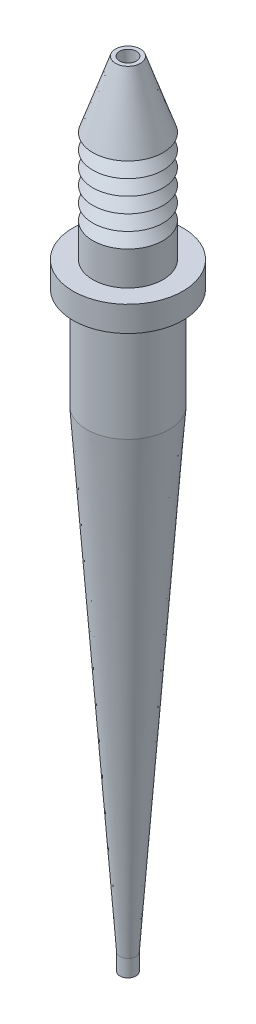
ISO-10303-21;
HEADER;
FILE_DESCRIPTION(('STEP AP214'),'2;1');
FILE_NAME('part.step','',(''),(''),'','','');
FILE_SCHEMA(('AUTOMOTIVE_DESIGN { 1 0 10303 214 1 1 1 1 }'));
ENDSEC;
DATA;
#1=APPLICATION_CONTEXT('core data for automotive mechanical design processes');
#2=APPLICATION_PROTOCOL_DEFINITION('international standard','automotive_design',2000,#1);
#3=PRODUCT_CONTEXT('',#1,'mechanical');
#4=PRODUCT('Part','Part','',(#3));
#5=PRODUCT_RELATED_PRODUCT_CATEGORY('part','',(#4));
#6=PRODUCT_DEFINITION_FORMATION('','',#4);
#7=PRODUCT_DEFINITION_CONTEXT('part definition',#1,'design');
#8=PRODUCT_DEFINITION('design','',#6,#7);
#9=PRODUCT_DEFINITION_SHAPE('','',#8);
#10=(LENGTH_UNIT() NAMED_UNIT(*) SI_UNIT(.MILLI.,.METRE.));
#11=(NAMED_UNIT(*) PLANE_ANGLE_UNIT() SI_UNIT($,.RADIAN.));
#12=(NAMED_UNIT(*) SI_UNIT($,.STERADIAN.) SOLID_ANGLE_UNIT());
#13=UNCERTAINTY_MEASURE_WITH_UNIT(LENGTH_MEASURE(1.E-05),#10,'distance_accuracy_value','');
#14=(GEOMETRIC_REPRESENTATION_CONTEXT(3) GLOBAL_UNCERTAINTY_ASSIGNED_CONTEXT((#13)) GLOBAL_UNIT_ASSIGNED_CONTEXT((#10,
#11,#12)) REPRESENTATION_CONTEXT('',''));
#15=CARTESIAN_POINT('',(0.,0.,0.));
#16=DIRECTION('',(0.,0.,1.));
#17=DIRECTION('',(1.,0.,0.));
#18=AXIS2_PLACEMENT_3D('',#15,#16,#17);
#19=CARTESIAN_POINT('',(0.950000000000014,-9.33673469387754,0.));
#20=DIRECTION('',(0.,1.,0.));
#21=DIRECTION('',(0.,0.,1.));
#22=AXIS2_PLACEMENT_3D('',#19,#20,#21);
#23=PLANE('',#22);
#24=CARTESIAN_POINT('',(0.,-9.33673469387754,0.));
#25=DIRECTION('',(0.,1.,0.));
#26=DIRECTION('',(0.,0.,1.));
#27=AXIS2_PLACEMENT_3D('',#24,#25,#26);
#28=CIRCLE('',#27,0.775000000000012);
#29=CARTESIAN_POINT('',(0.,-9.33673469387754,0.775000000000012));
#30=VERTEX_POINT('',#29);
#31=EDGE_CURVE('E48',#30,#30,#28,.T.);
#32=ORIENTED_EDGE('',*,*,#31,.T.);
#33=EDGE_LOOP('',(#32));
#34=FACE_BOUND('',#33,.T.);
#35=CARTESIAN_POINT('',(0.,-9.33673469387754,0.));
#36=DIRECTION('',(0.,1.,0.));
#37=DIRECTION('',(0.,0.,1.));
#38=AXIS2_PLACEMENT_3D('',#35,#36,#37);
#39=CIRCLE('',#38,0.950000000000014);
#40=CARTESIAN_POINT('',(0.,-9.33673469387754,0.950000000000014));
#41=VERTEX_POINT('',#40);
#42=EDGE_CURVE('E156',#41,#41,#39,.T.);
#43=ORIENTED_EDGE('',*,*,#42,.F.);
#44=EDGE_LOOP('',(#43));
#45=FACE_BOUND('',#44,.T.);
#46=ADVANCED_FACE('F39',(#34,#45),#23,.F.);
#47=CARTESIAN_POINT('',(0.,103.014460247081,0.));
#48=DIRECTION('',(0.,1.,0.));
#49=DIRECTION('',(0.,0.,1.));
#50=AXIS2_PLACEMENT_3D('',#47,#48,#49);
#51=CYLINDRICAL_SURFACE('',#50,0.575000000000014);
#52=CARTESIAN_POINT('',(0.,-9.13673469387755,0.));
#53=DIRECTION('',(0.,1.,0.));
#54=DIRECTION('',(0.,0.,1.));
#55=AXIS2_PLACEMENT_3D('',#52,#53,#54);
#56=CIRCLE('',#55,0.575000000000014);
#57=CARTESIAN_POINT('',(0.,-9.13673469387755,0.575000000000014));
#58=VERTEX_POINT('',#57);
#59=EDGE_CURVE('E10',#58,#58,#56,.F.);
#60=ORIENTED_EDGE('',*,*,#59,.T.);
#61=EDGE_LOOP('',(#60));
#62=FACE_BOUND('',#61,.T.);
#63=CARTESIAN_POINT('',(0.,-8.33673469387754,0.));
#64=DIRECTION('',(0.,1.,0.));
#65=DIRECTION('',(0.,0.,1.));
#66=AXIS2_PLACEMENT_3D('',#63,#64,#65);
#67=CIRCLE('',#66,0.575000000000014);
#68=CARTESIAN_POINT('',(0.,-8.33673469387754,0.575000000000014));
#69=VERTEX_POINT('',#68);
#70=EDGE_CURVE('E53',#69,#69,#67,.T.);
#71=ORIENTED_EDGE('',*,*,#70,.T.);
#72=EDGE_LOOP('',(#71));
#73=FACE_BOUND('',#72,.T.);
#74=ADVANCED_FACE('F164',(#62,#73),#51,.F.);
#75=CARTESIAN_POINT('',(0.575000000000014,-8.33673469387754,0.));
#76=DIRECTION('',(0.,1.,0.));
#77=DIRECTION('',(0.,0.,1.));
#78=AXIS2_PLACEMENT_3D('',#75,#76,#77);
#79=PLANE('',#78);
#80=ORIENTED_EDGE('',*,*,#70,.F.);
#81=EDGE_LOOP('',(#80));
#82=FACE_BOUND('',#81,.T.);
#83=CARTESIAN_POINT('',(0.,-8.33673469387754,0.));
#84=DIRECTION('',(0.,1.,0.));
#85=DIRECTION('',(0.,0.,1.));
#86=AXIS2_PLACEMENT_3D('',#83,#84,#85);
#87=CIRCLE('',#86,0.275000000000014);
#88=CARTESIAN_POINT('',(0.,-8.33673469387754,0.275000000000014));
#89=VERTEX_POINT('',#88);
#90=EDGE_CURVE('E58',#89,#89,#87,.T.);
#91=ORIENTED_EDGE('',*,*,#90,.T.);
#92=EDGE_LOOP('',(#91));
#93=FACE_BOUND('',#92,.T.);
#94=ADVANCED_FACE('F168',(#82,#93),#79,.F.);
#95=CARTESIAN_POINT('',(0.,103.014460247081,0.));
#96=DIRECTION('',(0.,1.,0.));
#97=DIRECTION('',(0.,0.,1.));
#98=AXIS2_PLACEMENT_3D('',#95,#96,#97);
#99=CYLINDRICAL_SURFACE('',#98,0.275000000000014);
#100=ORIENTED_EDGE('',*,*,#90,.F.);
#101=EDGE_LOOP('',(#100));
#102=FACE_BOUND('',#101,.T.);
#103=CARTESIAN_POINT('',(0.,-7.00267629513185,0.));
#104=DIRECTION('',(0.,1.,0.));
#105=DIRECTION('',(0.,0.,1.));
#106=AXIS2_PLACEMENT_3D('',#103,#104,#105);
#107=CIRCLE('',#106,0.275000000000014);
#108=CARTESIAN_POINT('',(0.,-7.00267629513184,0.275000000000014));
#109=VERTEX_POINT('',#108);
#110=EDGE_CURVE('E64',#109,#109,#107,.T.);
#111=ORIENTED_EDGE('',*,*,#110,.T.);
#112=EDGE_LOOP('',(#111));
#113=FACE_BOUND('',#112,.T.);
#114=ADVANCED_FACE('F173',(#102,#113),#99,.F.);
#115=CARTESIAN_POINT('',(0.,60.6632653061225,0.));
#116=DIRECTION('',(0.,1.,0.));
#117=DIRECTION('',(0.,0.,1.));
#118=AXIS2_PLACEMENT_3D('',#115,#116,#117);
#119=CONICAL_SURFACE('',#118,2.00000000000001,0.0254873636534141);
#120=CARTESIAN_POINT('',(0.,60.6632653061225,0.));
#121=DIRECTION('',(0.,1.,0.));
#122=DIRECTION('',(0.,0.,1.));
#123=AXIS2_PLACEMENT_3D('',#120,#121,#122);
#124=CIRCLE('',#123,2.00000000000001);
#125=CARTESIAN_POINT('',(0.,60.6632653061225,2.00000000000001));
#126=VERTEX_POINT('',#125);
#127=EDGE_CURVE('E68',#126,#126,#124,.T.);
#128=CARTESIAN_POINT('',(0.,-7.00267629513184,0.275000000000014));
#129=CARTESIAN_POINT('',(0.,-6.29782273678544,0.292968750000014));
#130=CARTESIAN_POINT('',(0.,-5.59296917843905,0.310937500000014));
#131=CARTESIAN_POINT('',(0.,-4.18326206174625,0.346875000000013));
#132=CARTESIAN_POINT('',(0.,-3.47840850339984,0.364843750000013));
#133=CARTESIAN_POINT('',(0.,-2.06870138670704,0.400781250000013));
#134=CARTESIAN_POINT('',(0.,-1.36384782836065,0.418750000000013));
#135=CARTESIAN_POINT('',(0.,0.0458592883321473,0.454687500000013));
#136=CARTESIAN_POINT('',(0.,0.750712846678545,0.472656250000013));
#137=CARTESIAN_POINT('',(0.,2.16041996337134,0.508593750000013));
#138=CARTESIAN_POINT('',(0.,2.86527352171774,0.526562500000012));
#139=CARTESIAN_POINT('',(0.,4.27498063841054,0.562500000000012));
#140=CARTESIAN_POINT('',(0.,4.97983419675694,0.580468750000012));
#141=CARTESIAN_POINT('',(0.,6.38954131344974,0.616406250000012));
#142=CARTESIAN_POINT('',(0.,7.09439487179614,0.634375000000012));
#143=CARTESIAN_POINT('',(0.,8.50410198848894,0.670312500000012));
#144=CARTESIAN_POINT('',(0.,9.20895554683533,0.688281250000012));
#145=CARTESIAN_POINT('',(0.,10.6186626635281,0.724218750000012));
#146=CARTESIAN_POINT('',(0.,11.3235162218745,0.742187500000012));
#147=CARTESIAN_POINT('',(0.,12.7332233385673,0.778125000000011));
#148=CARTESIAN_POINT('',(0.,13.4380768969137,0.796093750000011));
#149=CARTESIAN_POINT('',(0.,14.8477840136065,0.832031250000011));
#150=CARTESIAN_POINT('',(0.,15.5526375719529,0.850000000000011));
#151=CARTESIAN_POINT('',(0.,16.9623446886457,0.885937500000011));
#152=CARTESIAN_POINT('',(0.,17.6671982469921,0.903906250000011));
#153=CARTESIAN_POINT('',(0.,19.0769053636849,0.939843750000011));
#154=CARTESIAN_POINT('',(0.,19.7817589220313,0.95781250000001));
#155=CARTESIAN_POINT('',(0.,21.1914660387241,0.99375000000001));
#156=CARTESIAN_POINT('',(0.,21.8963195970705,1.01171875000001));
#157=CARTESIAN_POINT('',(0.,23.3060267137633,1.04765625000001));
#158=CARTESIAN_POINT('',(0.,24.0108802721097,1.06562500000001));
#159=CARTESIAN_POINT('',(0.,25.4205873888025,1.10156250000001));
#160=CARTESIAN_POINT('',(0.,26.1254409471489,1.11953125000001));
#161=CARTESIAN_POINT('',(0.,27.5351480638417,1.15546875000001));
#162=CARTESIAN_POINT('',(0.,28.2400016221881,1.17343750000001));
#163=CARTESIAN_POINT('',(0.,29.6497087388809,1.20937500000001));
#164=CARTESIAN_POINT('',(0.,30.3545622972273,1.22734375000001));
#165=CARTESIAN_POINT('',(0.,31.7642694139201,1.26328125000001));
#166=CARTESIAN_POINT('',(0.,32.4691229722665,1.28125000000001));
#167=CARTESIAN_POINT('',(0.,33.8788300889593,1.31718750000001));
#168=CARTESIAN_POINT('',(0.,34.5836836473057,1.33515625000001));
#169=CARTESIAN_POINT('',(0.,35.9933907639985,1.37109375000001));
#170=CARTESIAN_POINT('',(0.,36.6982443223449,1.38906250000001));
#171=CARTESIAN_POINT('',(0.,38.1079514390377,1.42500000000001));
#172=CARTESIAN_POINT('',(0.,38.8128049973841,1.44296875000001));
#173=CARTESIAN_POINT('',(0.,40.2225121140769,1.47890625000001));
#174=CARTESIAN_POINT('',(0.,40.9273656724233,1.49687500000001));
#175=CARTESIAN_POINT('',(0.,42.3370727891161,1.53281250000001));
#176=CARTESIAN_POINT('',(0.,43.0419263474625,1.55078125000001));
#177=CARTESIAN_POINT('',(0.,44.4516334641553,1.58671875000001));
#178=CARTESIAN_POINT('',(0.,45.1564870225017,1.60468750000001));
#179=CARTESIAN_POINT('',(0.,46.5661941391945,1.64062500000001));
#180=CARTESIAN_POINT('',(0.,47.2710476975409,1.65859375000001));
#181=CARTESIAN_POINT('',(0.,48.6807548142337,1.69453125000001));
#182=CARTESIAN_POINT('',(0.,49.3856083725801,1.71250000000001));
#183=CARTESIAN_POINT('',(0.,50.7953154892729,1.74843750000001));
#184=CARTESIAN_POINT('',(0.,51.5001690476193,1.76640625000001));
#185=CARTESIAN_POINT('',(0.,52.9098761643121,1.80234375000001));
#186=CARTESIAN_POINT('',(0.,53.6147297226585,1.82031250000001));
#187=CARTESIAN_POINT('',(0.,55.0244368393513,1.85625000000001));
#188=CARTESIAN_POINT('',(0.,55.7292903976977,1.87421875000001));
#189=CARTESIAN_POINT('',(0.,57.1389975143905,1.91015625000001));
#190=CARTESIAN_POINT('',(0.,57.8438510727369,1.92812500000001));
#191=CARTESIAN_POINT('',(0.,59.2535581894297,1.96406250000001));
#192=CARTESIAN_POINT('',(0.,59.9584117477761,1.98203125000001));
#193=CARTESIAN_POINT('',(0.,60.6632653061225,2.00000000000001));
#194=B_SPLINE_CURVE_WITH_KNOTS('',3,(#128,#129,#130,#131,#132,#133,#134,#135,#136,#137,#138,
#139,#140,#141,#142,#143,#144,#145,#146,#147,#148,#149,#150,#151,#152,#153,#154,#155,#156,#157,
#158,#159,#160,#161,#162,#163,#164,#165,#166,#167,#168,#169,#170,#171,#172,#173,#174,#175,#176,
#177,#178,#179,#180,#181,#182,#183,#184,#185,#186,#187,#188,#189,#190,#191,#192,#193),
.UNSPECIFIED.,.F.,.F.,(4,2,2,2,2,2,2,2,2,2,2,2,2,2,2,2,2,2,2,2,2,2,2,2,2,2,2,2,2,2,2,2,4),(0.,
2.11524767632806,4.23049535265614,6.3457430289842,8.46099070531226,10.5762383816403,
12.6914860579684,14.8067337342965,16.9219814106245,19.0372290869526,21.1524767632807,
23.2677244396087,25.3829721159368,27.4982197922649,29.613467468593,31.728715144921,
33.8439628212491,35.9592104975772,38.0744581739052,40.1897058502333,42.3049535265613,
44.4202012028894,46.5354488792175,48.6506965555456,50.7659442318736,52.8811919082017,
54.9964395845298,57.1116872608578,59.2269349371859,61.342182613514,63.457430289842,
65.5726779661701,67.6879256424982),.UNSPECIFIED.);
#195=EDGE_CURVE('BSEAM177',#109,#126,#194,.T.);
#196=ORIENTED_EDGE('',*,*,#110,.F.);
#197=ORIENTED_EDGE('',*,*,#127,.T.);
#198=ORIENTED_EDGE('',*,*,#195,.T.);
#199=ORIENTED_EDGE('',*,*,#195,.F.);
#200=EDGE_LOOP('',(#196,#198,#197,#199));
#201=FACE_BOUND('',#200,.T.);
#202=ADVANCED_FACE('F177',(#201),#119,.F.);
#203=CARTESIAN_POINT('',(0.,103.014460247081,0.));
#204=DIRECTION('',(0.,1.,0.));
#205=DIRECTION('',(0.,0.,1.));
#206=AXIS2_PLACEMENT_3D('',#203,#204,#205);
#207=CYLINDRICAL_SURFACE('',#206,2.00000000000001);
#208=ORIENTED_EDGE('',*,*,#127,.F.);
#209=EDGE_LOOP('',(#208));
#210=FACE_BOUND('',#209,.T.);
#211=CARTESIAN_POINT('',(0.,63.6632653061225,0.));
#212=DIRECTION('',(0.,1.,0.));
#213=DIRECTION('',(0.,0.,1.));
#214=AXIS2_PLACEMENT_3D('',#211,#212,#213);
#215=CIRCLE('',#214,2.00000000000001);
#216=CARTESIAN_POINT('',(0.,63.6632653061225,2.00000000000001));
#217=VERTEX_POINT('',#216);
#218=EDGE_CURVE('E72',#217,#217,#215,.T.);
#219=ORIENTED_EDGE('',*,*,#218,.T.);
#220=EDGE_LOOP('',(#219));
#221=FACE_BOUND('',#220,.T.);
#222=ADVANCED_FACE('F181',(#210,#221),#207,.F.);
#223=CARTESIAN_POINT('',(0.,68.9685091498534,0.));
#224=DIRECTION('',(0.,-1.,0.));
#225=DIRECTION('',(0.,0.,-1.));
#226=AXIS2_PLACEMENT_3D('',#223,#224,#225);
#227=CONICAL_SURFACE('',#226,1.,0.186306810965033);
#228=ORIENTED_EDGE('',*,*,#218,.F.);
#229=EDGE_LOOP('',(#228));
#230=FACE_BOUND('',#229,.T.);
#231=CARTESIAN_POINT('',(0.,68.9685091498534,0.));
#232=DIRECTION('',(0.,1.,0.));
#233=DIRECTION('',(0.,0.,1.));
#234=AXIS2_PLACEMENT_3D('',#231,#232,#233);
#235=CIRCLE('',#234,1.);
#236=CARTESIAN_POINT('',(0.,68.9685091498534,1.));
#237=VERTEX_POINT('',#236);
#238=EDGE_CURVE('E76',#237,#237,#235,.T.);
#239=ORIENTED_EDGE('',*,*,#238,.T.);
#240=EDGE_LOOP('',(#239));
#241=FACE_BOUND('',#240,.T.);
#242=ADVANCED_FACE('F185',(#230,#241),#227,.F.);
#243=CARTESIAN_POINT('',(0.,103.014460247081,0.));
#244=DIRECTION('',(0.,1.,0.));
#245=DIRECTION('',(0.,0.,1.));
#246=AXIS2_PLACEMENT_3D('',#243,#244,#245);
#247=CYLINDRICAL_SURFACE('',#246,1.);
#248=ORIENTED_EDGE('',*,*,#238,.F.);
#249=EDGE_LOOP('',(#248));
#250=FACE_BOUND('',#249,.T.);
#251=CARTESIAN_POINT('',(0.,84.5107567184522,0.));
#252=DIRECTION('',(0.,1.,0.));
#253=DIRECTION('',(0.,0.,1.));
#254=AXIS2_PLACEMENT_3D('',#251,#252,#253);
#255=CIRCLE('',#254,1.);
#256=CARTESIAN_POINT('',(0.,84.5107567184522,1.));
#257=VERTEX_POINT('',#256);
#258=EDGE_CURVE('E80',#257,#257,#255,.T.);
#259=ORIENTED_EDGE('',*,*,#258,.T.);
#260=EDGE_LOOP('',(#259));
#261=FACE_BOUND('',#260,.T.);
#262=ADVANCED_FACE('F189',(#250,#261),#247,.F.);
#263=CARTESIAN_POINT('',(1.,84.5107567184522,0.));
#264=DIRECTION('',(0.,-1.,0.));
#265=DIRECTION('',(0.,0.,-1.));
#266=AXIS2_PLACEMENT_3D('',#263,#264,#265);
#267=PLANE('',#266);
#268=ORIENTED_EDGE('',*,*,#258,.F.);
#269=EDGE_LOOP('',(#268));
#270=FACE_BOUND('',#269,.T.);
#271=CARTESIAN_POINT('',(0.,84.5107567184522,0.));
#272=DIRECTION('',(0.,1.,0.));
#273=DIRECTION('',(0.,0.,1.));
#274=AXIS2_PLACEMENT_3D('',#271,#272,#273);
#275=CIRCLE('',#274,1.47420639426088);
#276=CARTESIAN_POINT('',(0.,84.5107567184522,1.47420639426088));
#277=VERTEX_POINT('',#276);
#278=EDGE_CURVE('E84',#277,#277,#275,.T.);
#279=ORIENTED_EDGE('',*,*,#278,.T.);
#280=EDGE_LOOP('',(#279));
#281=FACE_BOUND('',#280,.T.);
#282=ADVANCED_FACE('F193',(#270,#281),#267,.F.);
#283=CARTESIAN_POINT('',(0.,76.6894845247773,0.));
#284=DIRECTION('',(0.,-1.,0.));
#285=DIRECTION('',(0.,0.,-1.));
#286=AXIS2_PLACEMENT_3D('',#283,#284,#285);
#287=CONICAL_SURFACE('',#286,4.15,0.329635306726198);
#288=ORIENTED_EDGE('',*,*,#278,.F.);
#289=EDGE_LOOP('',(#288));
#290=FACE_BOUND('',#289,.T.);
#291=CARTESIAN_POINT('',(0.,76.6894845247773,0.));
#292=DIRECTION('',(0.,1.,0.));
#293=DIRECTION('',(0.,0.,1.));
#294=AXIS2_PLACEMENT_3D('',#291,#292,#293);
#295=CIRCLE('',#294,4.15);
#296=CARTESIAN_POINT('',(0.,76.6894845247773,4.15));
#297=VERTEX_POINT('',#296);
#298=EDGE_CURVE('E88',#297,#297,#295,.T.);
#299=ORIENTED_EDGE('',*,*,#298,.T.);
#300=EDGE_LOOP('',(#299));
#301=FACE_BOUND('',#300,.T.);
#302=ADVANCED_FACE('F197',(#290,#301),#287,.T.);
#303=CARTESIAN_POINT('',(2.64841725112298,76.6894845247773,0.));
#304=DIRECTION('',(0.,1.,0.));
#305=DIRECTION('',(0.,0.,1.));
#306=AXIS2_PLACEMENT_3D('',#303,#304,#305);
#307=PLANE('',#306);
#308=ORIENTED_EDGE('',*,*,#298,.F.);
#309=EDGE_LOOP('',(#308));
#310=FACE_BOUND('',#309,.T.);
#311=CARTESIAN_POINT('',(0.,76.6894845247773,0.));
#312=DIRECTION('',(0.,1.,0.));
#313=DIRECTION('',(0.,0.,1.));
#314=AXIS2_PLACEMENT_3D('',#311,#312,#313);
#315=CIRCLE('',#314,2.64841725112298);
#316=CARTESIAN_POINT('',(0.,76.6894845247773,2.64841725112298));
#317=VERTEX_POINT('',#316);
#318=EDGE_CURVE('E92',#317,#317,#315,.T.);
#319=ORIENTED_EDGE('',*,*,#318,.T.);
#320=EDGE_LOOP('',(#319));
#321=FACE_BOUND('',#320,.T.);
#322=ADVANCED_FACE('F201',(#310,#321),#307,.F.);
#323=CARTESIAN_POINT('',(0.,74.8842406810463,0.));
#324=DIRECTION('',(0.,-1.,0.));
#325=DIRECTION('',(0.,0.,-1.));
#326=AXIS2_PLACEMENT_3D('',#323,#324,#325);
#327=CONICAL_SURFACE('',#326,4.15,0.693826428376896);
#328=ORIENTED_EDGE('',*,*,#318,.F.);
#329=EDGE_LOOP('',(#328));
#330=FACE_BOUND('',#329,.T.);
#331=CARTESIAN_POINT('',(0.,74.8842406810463,0.));
#332=DIRECTION('',(0.,1.,0.));
#333=DIRECTION('',(0.,0.,1.));
#334=AXIS2_PLACEMENT_3D('',#331,#332,#333);
#335=CIRCLE('',#334,4.15);
#336=CARTESIAN_POINT('',(0.,74.8842406810463,4.15));
#337=VERTEX_POINT('',#336);
#338=EDGE_CURVE('E96',#337,#337,#335,.T.);
#339=ORIENTED_EDGE('',*,*,#338,.T.);
#340=EDGE_LOOP('',(#339));
#341=FACE_BOUND('',#340,.T.);
#342=ADVANCED_FACE('F205',(#330,#341),#327,.T.);
#343=CARTESIAN_POINT('',(2.64841725112298,74.8842406810463,0.));
#344=DIRECTION('',(0.,1.,0.));
#345=DIRECTION('',(0.,0.,1.));
#346=AXIS2_PLACEMENT_3D('',#343,#344,#345);
#347=PLANE('',#346);
#348=ORIENTED_EDGE('',*,*,#338,.F.);
#349=EDGE_LOOP('',(#348));
#350=FACE_BOUND('',#349,.T.);
#351=CARTESIAN_POINT('',(0.,74.8842406810463,0.));
#352=DIRECTION('',(0.,1.,0.));
#353=DIRECTION('',(0.,0.,1.));
#354=AXIS2_PLACEMENT_3D('',#351,#352,#353);
#355=CIRCLE('',#354,2.64841725112298);
#356=CARTESIAN_POINT('',(0.,74.8842406810463,2.64841725112298));
#357=VERTEX_POINT('',#356);
#358=EDGE_CURVE('E100',#357,#357,#355,.T.);
#359=ORIENTED_EDGE('',*,*,#358,.T.);
#360=EDGE_LOOP('',(#359));
#361=FACE_BOUND('',#360,.T.);
#362=ADVANCED_FACE('F209',(#350,#361),#347,.F.);
#363=CARTESIAN_POINT('',(0.,73.0789968373153,0.));
#364=DIRECTION('',(0.,-1.,0.));
#365=DIRECTION('',(0.,0.,-1.));
#366=AXIS2_PLACEMENT_3D('',#363,#364,#365);
#367=CONICAL_SURFACE('',#366,4.15,0.693826428376896);
#368=ORIENTED_EDGE('',*,*,#358,.F.);
#369=EDGE_LOOP('',(#368));
#370=FACE_BOUND('',#369,.T.);
#371=CARTESIAN_POINT('',(0.,73.0789968373153,0.));
#372=DIRECTION('',(0.,1.,0.));
#373=DIRECTION('',(0.,0.,1.));
#374=AXIS2_PLACEMENT_3D('',#371,#372,#373);
#375=CIRCLE('',#374,4.15);
#376=CARTESIAN_POINT('',(0.,73.0789968373153,4.15));
#377=VERTEX_POINT('',#376);
#378=EDGE_CURVE('E104',#377,#377,#375,.T.);
#379=ORIENTED_EDGE('',*,*,#378,.T.);
#380=EDGE_LOOP('',(#379));
#381=FACE_BOUND('',#380,.T.);
#382=ADVANCED_FACE('F213',(#370,#381),#367,.T.);
#383=CARTESIAN_POINT('',(2.64841725112298,73.0789968373153,0.));
#384=DIRECTION('',(0.,1.,0.));
#385=DIRECTION('',(0.,0.,1.));
#386=AXIS2_PLACEMENT_3D('',#383,#384,#385);
#387=PLANE('',#386);
#388=ORIENTED_EDGE('',*,*,#378,.F.);
#389=EDGE_LOOP('',(#388));
#390=FACE_BOUND('',#389,.T.);
#391=CARTESIAN_POINT('',(0.,73.0789968373153,0.));
#392=DIRECTION('',(0.,1.,0.));
#393=DIRECTION('',(0.,0.,1.));
#394=AXIS2_PLACEMENT_3D('',#391,#392,#393);
#395=CIRCLE('',#394,2.64841725112298);
#396=CARTESIAN_POINT('',(0.,73.0789968373153,2.64841725112298));
#397=VERTEX_POINT('',#396);
#398=EDGE_CURVE('E108',#397,#397,#395,.T.);
#399=ORIENTED_EDGE('',*,*,#398,.T.);
#400=EDGE_LOOP('',(#399));
#401=FACE_BOUND('',#400,.T.);
#402=ADVANCED_FACE('F217',(#390,#401),#387,.F.);
#403=CARTESIAN_POINT('',(0.,71.2737529935844,0.));
#404=DIRECTION('',(0.,-1.,0.));
#405=DIRECTION('',(0.,0.,-1.));
#406=AXIS2_PLACEMENT_3D('',#403,#404,#405);
#407=CONICAL_SURFACE('',#406,4.15,0.693826428376896);
#408=ORIENTED_EDGE('',*,*,#398,.F.);
#409=EDGE_LOOP('',(#408));
#410=FACE_BOUND('',#409,.T.);
#411=CARTESIAN_POINT('',(0.,71.2737529935844,0.));
#412=DIRECTION('',(0.,1.,0.));
#413=DIRECTION('',(0.,0.,1.));
#414=AXIS2_PLACEMENT_3D('',#411,#412,#413);
#415=CIRCLE('',#414,4.15);
#416=CARTESIAN_POINT('',(0.,71.2737529935844,4.15));
#417=VERTEX_POINT('',#416);
#418=EDGE_CURVE('E112',#417,#417,#415,.T.);
#419=ORIENTED_EDGE('',*,*,#418,.T.);
#420=EDGE_LOOP('',(#419));
#421=FACE_BOUND('',#420,.T.);
#422=ADVANCED_FACE('F221',(#410,#421),#407,.T.);
#423=CARTESIAN_POINT('',(2.64841725112298,71.2737529935844,0.));
#424=DIRECTION('',(0.,1.,0.));
#425=DIRECTION('',(0.,0.,1.));
#426=AXIS2_PLACEMENT_3D('',#423,#424,#425);
#427=PLANE('',#426);
#428=ORIENTED_EDGE('',*,*,#418,.F.);
#429=EDGE_LOOP('',(#428));
#430=FACE_BOUND('',#429,.T.);
#431=CARTESIAN_POINT('',(0.,71.2737529935844,0.));
#432=DIRECTION('',(0.,1.,0.));
#433=DIRECTION('',(0.,0.,1.));
#434=AXIS2_PLACEMENT_3D('',#431,#432,#433);
#435=CIRCLE('',#434,2.64841725112298);
#436=CARTESIAN_POINT('',(0.,71.2737529935844,2.64841725112298));
#437=VERTEX_POINT('',#436);
#438=EDGE_CURVE('E116',#437,#437,#435,.T.);
#439=ORIENTED_EDGE('',*,*,#438,.T.);
#440=EDGE_LOOP('',(#439));
#441=FACE_BOUND('',#440,.T.);
#442=ADVANCED_FACE('F225',(#430,#441),#427,.F.);
#443=CARTESIAN_POINT('',(0.,69.4685091498534,0.));
#444=DIRECTION('',(0.,-1.,0.));
#445=DIRECTION('',(0.,0.,-1.));
#446=AXIS2_PLACEMENT_3D('',#443,#444,#445);
#447=CONICAL_SURFACE('',#446,4.15,0.693826428376896);
#448=ORIENTED_EDGE('',*,*,#438,.F.);
#449=EDGE_LOOP('',(#448));
#450=FACE_BOUND('',#449,.T.);
#451=CARTESIAN_POINT('',(0.,69.4685091498534,0.));
#452=DIRECTION('',(0.,1.,0.));
#453=DIRECTION('',(0.,0.,1.));
#454=AXIS2_PLACEMENT_3D('',#451,#452,#453);
#455=CIRCLE('',#454,4.15);
#456=CARTESIAN_POINT('',(0.,69.4685091498534,4.15));
#457=VERTEX_POINT('',#456);
#458=EDGE_CURVE('E120',#457,#457,#455,.T.);
#459=ORIENTED_EDGE('',*,*,#458,.T.);
#460=EDGE_LOOP('',(#459));
#461=FACE_BOUND('',#460,.T.);
#462=ADVANCED_FACE('F229',(#450,#461),#447,.T.);
#463=CARTESIAN_POINT('',(2.64841725112299,69.4685091498534,0.));
#464=DIRECTION('',(0.,1.,0.));
#465=DIRECTION('',(0.,0.,1.));
#466=AXIS2_PLACEMENT_3D('',#463,#464,#465);
#467=PLANE('',#466);
#468=ORIENTED_EDGE('',*,*,#458,.F.);
#469=EDGE_LOOP('',(#468));
#470=FACE_BOUND('',#469,.T.);
#471=CARTESIAN_POINT('',(0.,69.4685091498534,0.));
#472=DIRECTION('',(0.,1.,0.));
#473=DIRECTION('',(0.,0.,1.));
#474=AXIS2_PLACEMENT_3D('',#471,#472,#473);
#475=CIRCLE('',#474,2.64841725112299);
#476=CARTESIAN_POINT('',(0.,69.4685091498534,2.64841725112299));
#477=VERTEX_POINT('',#476);
#478=EDGE_CURVE('E124',#477,#477,#475,.T.);
#479=ORIENTED_EDGE('',*,*,#478,.T.);
#480=EDGE_LOOP('',(#479));
#481=FACE_BOUND('',#480,.T.);
#482=ADVANCED_FACE('F233',(#470,#481),#467,.F.);
#483=CARTESIAN_POINT('',(0.,67.6632653061225,0.));
#484=DIRECTION('',(0.,-1.,0.));
#485=DIRECTION('',(0.,0.,-1.));
#486=AXIS2_PLACEMENT_3D('',#483,#484,#485);
#487=CONICAL_SURFACE('',#486,4.15000000000001,0.693826428376896);
#488=ORIENTED_EDGE('',*,*,#478,.F.);
#489=EDGE_LOOP('',(#488));
#490=FACE_BOUND('',#489,.T.);
#491=CARTESIAN_POINT('',(0.,67.6632653061225,0.));
#492=DIRECTION('',(0.,1.,0.));
#493=DIRECTION('',(0.,0.,1.));
#494=AXIS2_PLACEMENT_3D('',#491,#492,#493);
#495=CIRCLE('',#494,4.15000000000001);
#496=CARTESIAN_POINT('',(0.,67.6632653061225,4.15000000000001));
#497=VERTEX_POINT('',#496);
#498=EDGE_CURVE('E128',#497,#497,#495,.T.);
#499=ORIENTED_EDGE('',*,*,#498,.T.);
#500=EDGE_LOOP('',(#499));
#501=FACE_BOUND('',#500,.T.);
#502=ADVANCED_FACE('F237',(#490,#501),#487,.T.);
#503=CARTESIAN_POINT('',(0.,103.014460247081,0.));
#504=DIRECTION('',(0.,1.,0.));
#505=DIRECTION('',(0.,0.,1.));
#506=AXIS2_PLACEMENT_3D('',#503,#504,#505);
#507=CYLINDRICAL_SURFACE('',#506,4.15000000000001);
#508=ORIENTED_EDGE('',*,*,#498,.F.);
#509=EDGE_LOOP('',(#508));
#510=FACE_BOUND('',#509,.T.);
#511=CARTESIAN_POINT('',(0.,63.6632653061225,0.));
#512=DIRECTION('',(0.,1.,0.));
#513=DIRECTION('',(0.,0.,1.));
#514=AXIS2_PLACEMENT_3D('',#511,#512,#513);
#515=CIRCLE('',#514,4.15000000000001);
#516=CARTESIAN_POINT('',(0.,63.6632653061225,4.15000000000001));
#517=VERTEX_POINT('',#516);
#518=EDGE_CURVE('E132',#517,#517,#515,.T.);
#519=ORIENTED_EDGE('',*,*,#518,.T.);
#520=EDGE_LOOP('',(#519));
#521=FACE_BOUND('',#520,.T.);
#522=ADVANCED_FACE('F241',(#510,#521),#507,.T.);
#523=CARTESIAN_POINT('',(6.5,63.6632653061225,0.));
#524=DIRECTION('',(0.,-1.,0.));
#525=DIRECTION('',(0.,0.,-1.));
#526=AXIS2_PLACEMENT_3D('',#523,#524,#525);
#527=PLANE('',#526);
#528=ORIENTED_EDGE('',*,*,#518,.F.);
#529=EDGE_LOOP('',(#528));
#530=FACE_BOUND('',#529,.T.);
#531=CARTESIAN_POINT('',(0.,63.6632653061225,0.));
#532=DIRECTION('',(0.,1.,0.));
#533=DIRECTION('',(0.,0.,1.));
#534=AXIS2_PLACEMENT_3D('',#531,#532,#533);
#535=CIRCLE('',#534,6.5);
#536=CARTESIAN_POINT('',(0.,63.6632653061225,6.5));
#537=VERTEX_POINT('',#536);
#538=EDGE_CURVE('E136',#537,#537,#535,.T.);
#539=ORIENTED_EDGE('',*,*,#538,.T.);
#540=EDGE_LOOP('',(#539));
#541=FACE_BOUND('',#540,.T.);
#542=ADVANCED_FACE('F245',(#530,#541),#527,.F.);
#543=CARTESIAN_POINT('',(0.,103.014460247081,0.));
#544=DIRECTION('',(0.,1.,0.));
#545=DIRECTION('',(0.,0.,1.));
#546=AXIS2_PLACEMENT_3D('',#543,#544,#545);
#547=CYLINDRICAL_SURFACE('',#546,6.5);
#548=ORIENTED_EDGE('',*,*,#538,.F.);
#549=EDGE_LOOP('',(#548));
#550=FACE_BOUND('',#549,.T.);
#551=CARTESIAN_POINT('',(0.,60.6632653061225,0.));
#552=DIRECTION('',(0.,1.,0.));
#553=DIRECTION('',(0.,0.,1.));
#554=AXIS2_PLACEMENT_3D('',#551,#552,#553);
#555=CIRCLE('',#554,6.50000000000001);
#556=CARTESIAN_POINT('',(0.,60.6632653061225,6.50000000000001));
#557=VERTEX_POINT('',#556);
#558=EDGE_CURVE('E140',#557,#557,#555,.T.);
#559=ORIENTED_EDGE('',*,*,#558,.T.);
#560=EDGE_LOOP('',(#559));
#561=FACE_BOUND('',#560,.T.);
#562=ADVANCED_FACE('F249',(#550,#561),#547,.T.);
#563=CARTESIAN_POINT('',(6.50000000000001,60.6632653061225,0.));
#564=DIRECTION('',(0.,1.,0.));
#565=DIRECTION('',(0.,0.,1.));
#566=AXIS2_PLACEMENT_3D('',#563,#564,#565);
#567=PLANE('',#566);
#568=ORIENTED_EDGE('',*,*,#558,.F.);
#569=EDGE_LOOP('',(#568));
#570=FACE_BOUND('',#569,.T.);
#571=CARTESIAN_POINT('',(0.,60.6632653061225,0.));
#572=DIRECTION('',(0.,1.,0.));
#573=DIRECTION('',(0.,0.,1.));
#574=AXIS2_PLACEMENT_3D('',#571,#572,#573);
#575=CIRCLE('',#574,4.87500000000001);
#576=CARTESIAN_POINT('',(0.,60.6632653061225,4.87500000000001));
#577=VERTEX_POINT('',#576);
#578=EDGE_CURVE('E144',#577,#577,#575,.T.);
#579=ORIENTED_EDGE('',*,*,#578,.T.);
#580=EDGE_LOOP('',(#579));
#581=FACE_BOUND('',#580,.T.);
#582=ADVANCED_FACE('F253',(#570,#581),#567,.F.);
#583=CARTESIAN_POINT('',(0.,103.014460247081,0.));
#584=DIRECTION('',(0.,1.,0.));
#585=DIRECTION('',(0.,0.,1.));
#586=AXIS2_PLACEMENT_3D('',#583,#584,#585);
#587=CYLINDRICAL_SURFACE('',#586,4.87500000000001);
#588=ORIENTED_EDGE('',*,*,#578,.F.);
#589=EDGE_LOOP('',(#588));
#590=FACE_BOUND('',#589,.T.);
#591=CARTESIAN_POINT('',(0.,48.6632653061225,0.));
#592=DIRECTION('',(0.,1.,0.));
#593=DIRECTION('',(0.,0.,1.));
#594=AXIS2_PLACEMENT_3D('',#591,#592,#593);
#595=CIRCLE('',#594,4.87500000000001);
#596=CARTESIAN_POINT('',(0.,48.6632653061225,4.87500000000001));
#597=VERTEX_POINT('',#596);
#598=EDGE_CURVE('E148',#597,#597,#595,.T.);
#599=ORIENTED_EDGE('',*,*,#598,.T.);
#600=EDGE_LOOP('',(#599));
#601=FACE_BOUND('',#600,.T.);
#602=ADVANCED_FACE('F257',(#590,#601),#587,.T.);
#603=CARTESIAN_POINT('',(0.,-7.33673469387754,0.));
#604=DIRECTION('',(0.,1.,0.));
#605=DIRECTION('',(0.,0.,1.));
#606=AXIS2_PLACEMENT_3D('',#603,#604,#605);
#607=CONICAL_SURFACE('',#606,0.950000000000015,0.0699748514293877);
#608=CARTESIAN_POINT('',(0.,-7.33673469387754,0.));
#609=DIRECTION('',(0.,1.,0.));
#610=DIRECTION('',(0.,0.,1.));
#611=AXIS2_PLACEMENT_3D('',#608,#609,#610);
#612=CIRCLE('',#611,0.950000000000015);
#613=CARTESIAN_POINT('',(0.,-7.33673469387754,0.950000000000015));
#614=VERTEX_POINT('',#613);
#615=EDGE_CURVE('E152',#614,#614,#612,.T.);
#616=CARTESIAN_POINT('',(0.,48.6632653061225,4.87500000000001));
#617=CARTESIAN_POINT('',(0.,48.0799319727891,4.83411458333334));
#618=CARTESIAN_POINT('',(0.,47.4965986394558,4.79322916666667));
#619=CARTESIAN_POINT('',(0.,46.3299319727891,4.71145833333334));
#620=CARTESIAN_POINT('',(0.,45.7465986394558,4.67057291666667));
#621=CARTESIAN_POINT('',(0.,44.5799319727891,4.58880208333334));
#622=CARTESIAN_POINT('',(0.,43.9965986394558,4.54791666666667));
#623=CARTESIAN_POINT('',(0.,42.8299319727891,4.46614583333334));
#624=CARTESIAN_POINT('',(0.,42.2465986394558,4.42526041666667));
#625=CARTESIAN_POINT('',(0.,41.0799319727891,4.34348958333334));
#626=CARTESIAN_POINT('',(0.,40.4965986394558,4.30260416666667));
#627=CARTESIAN_POINT('',(0.,39.3299319727891,4.22083333333334));
#628=CARTESIAN_POINT('',(0.,38.7465986394558,4.17994791666668));
#629=CARTESIAN_POINT('',(0.,37.5799319727891,4.09817708333334));
#630=CARTESIAN_POINT('',(0.,36.9965986394558,4.05729166666667));
#631=CARTESIAN_POINT('',(0.,35.8299319727891,3.97552083333334));
#632=CARTESIAN_POINT('',(0.,35.2465986394558,3.93463541666668));
#633=CARTESIAN_POINT('',(0.,34.0799319727891,3.85286458333334));
#634=CARTESIAN_POINT('',(0.,33.4965986394558,3.81197916666668));
#635=CARTESIAN_POINT('',(0.,32.3299319727891,3.73020833333334));
#636=CARTESIAN_POINT('',(0.,31.7465986394558,3.68932291666668));
#637=CARTESIAN_POINT('',(0.,30.5799319727891,3.60755208333334));
#638=CARTESIAN_POINT('',(0.,29.9965986394558,3.56666666666668));
#639=CARTESIAN_POINT('',(0.,28.8299319727891,3.48489583333334));
#640=CARTESIAN_POINT('',(0.,28.2465986394558,3.44401041666668));
#641=CARTESIAN_POINT('',(0.,27.0799319727891,3.36223958333334));
#642=CARTESIAN_POINT('',(0.,26.4965986394558,3.32135416666668));
#643=CARTESIAN_POINT('',(0.,25.3299319727891,3.23958333333334));
#644=CARTESIAN_POINT('',(0.,24.7465986394558,3.19869791666668));
#645=CARTESIAN_POINT('',(0.,23.5799319727891,3.11692708333334));
#646=CARTESIAN_POINT('',(0.,22.9965986394558,3.07604166666668));
#647=CARTESIAN_POINT('',(0.,21.8299319727891,2.99427083333334));
#648=CARTESIAN_POINT('',(0.,21.2465986394558,2.95338541666668));
#649=CARTESIAN_POINT('',(0.,20.0799319727891,2.87161458333334));
#650=CARTESIAN_POINT('',(0.,19.4965986394558,2.83072916666668));
#651=CARTESIAN_POINT('',(0.,18.3299319727891,2.74895833333334));
#652=CARTESIAN_POINT('',(0.,17.7465986394558,2.70807291666668));
#653=CARTESIAN_POINT('',(0.,16.5799319727891,2.62630208333334));
#654=CARTESIAN_POINT('',(0.,15.9965986394558,2.58541666666668));
#655=CARTESIAN_POINT('',(0.,14.8299319727891,2.50364583333335));
#656=CARTESIAN_POINT('',(0.,14.2465986394558,2.46276041666668));
#657=CARTESIAN_POINT('',(0.,13.0799319727891,2.38098958333335));
#658=CARTESIAN_POINT('',(0.,12.4965986394558,2.34010416666668));
#659=CARTESIAN_POINT('',(0.,11.3299319727891,2.25833333333335));
#660=CARTESIAN_POINT('',(0.,10.7465986394558,2.21744791666668));
#661=CARTESIAN_POINT('',(0.,9.57993197278913,2.13567708333335));
#662=CARTESIAN_POINT('',(0.,8.9965986394558,2.09479166666668));
#663=CARTESIAN_POINT('',(0.,7.82993197278913,2.01302083333335));
#664=CARTESIAN_POINT('',(0.,7.2465986394558,1.97213541666668));
#665=CARTESIAN_POINT('',(0.,6.07993197278913,1.89036458333335));
#666=CARTESIAN_POINT('',(0.,5.49659863945579,1.84947916666668));
#667=CARTESIAN_POINT('',(0.,4.32993197278913,1.76770833333335));
#668=CARTESIAN_POINT('',(0.,3.74659863945579,1.72682291666668));
#669=CARTESIAN_POINT('',(0.,2.57993197278913,1.64505208333335));
#670=CARTESIAN_POINT('',(0.,1.9965986394558,1.60416666666668));
#671=CARTESIAN_POINT('',(0.,0.829931972789131,1.52239583333335));
#672=CARTESIAN_POINT('',(0.,0.246598639455797,1.48151041666668));
#673=CARTESIAN_POINT('',(0.,-0.920068027210871,1.39973958333335));
#674=CARTESIAN_POINT('',(0.,-1.5034013605442,1.35885416666668));
#675=CARTESIAN_POINT('',(0.,-2.67006802721087,1.27708333333335));
#676=CARTESIAN_POINT('',(0.,-3.2534013605442,1.23619791666668));
#677=CARTESIAN_POINT('',(0.,-4.42006802721087,1.15442708333335));
#678=CARTESIAN_POINT('',(0.,-5.0034013605442,1.11354166666668));
#679=CARTESIAN_POINT('',(0.,-6.17006802721087,1.03177083333335));
#680=CARTESIAN_POINT('',(0.,-6.7534013605442,0.990885416666681));
#681=CARTESIAN_POINT('',(0.,-7.33673469387754,0.950000000000015));
#682=B_SPLINE_CURVE_WITH_KNOTS('',3,(#616,#617,#618,#619,#620,#621,#622,#623,#624,#625,#626,
#627,#628,#629,#630,#631,#632,#633,#634,#635,#636,#637,#638,#639,#640,#641,#642,#643,#644,#645,
#646,#647,#648,#649,#650,#651,#652,#653,#654,#655,#656,#657,#658,#659,#660,#661,#662,#663,#664,
#665,#666,#667,#668,#669,#670,#671,#672,#673,#674,#675,#676,#677,#678,#679,#680,#681),
.UNSPECIFIED.,.F.,.F.,(4,2,2,2,2,2,2,2,2,2,2,2,2,2,2,2,2,2,2,2,2,2,2,2,2,2,2,2,2,2,2,2,4),(0.,
1.75429317836674,3.50858635673347,5.2628795351002,7.01717271346694,8.77146589183368,
10.5257590702004,12.2800522485671,14.0343454269339,15.7886386053006,17.5429317836674,
19.2972249620341,21.0515181404008,22.8058113187676,24.5601044971343,26.314397675501,
28.0686908538678,29.8229840322345,31.5772772106012,33.331570388968,35.0858635673347,
36.8401567457014,38.5944499240682,40.3487431024349,42.1030362808016,43.8573294591684,
45.6116226375351,47.3659158159018,49.1202089942686,50.8745021726353,52.628795351002,
54.3830885293688,56.1373817077355),.UNSPECIFIED.);
#683=EDGE_CURVE('BSEAM261',#597,#614,#682,.T.);
#684=ORIENTED_EDGE('',*,*,#598,.F.);
#685=ORIENTED_EDGE('',*,*,#615,.T.);
#686=ORIENTED_EDGE('',*,*,#683,.T.);
#687=ORIENTED_EDGE('',*,*,#683,.F.);
#688=EDGE_LOOP('',(#684,#686,#685,#687));
#689=FACE_BOUND('',#688,.T.);
#690=ADVANCED_FACE('F261',(#689),#607,.T.);
#691=CARTESIAN_POINT('',(0.,103.014460247081,0.));
#692=DIRECTION('',(0.,1.,0.));
#693=DIRECTION('',(0.,0.,1.));
#694=AXIS2_PLACEMENT_3D('',#691,#692,#693);
#695=CYLINDRICAL_SURFACE('',#694,0.950000000000015);
#696=ORIENTED_EDGE('',*,*,#615,.F.);
#697=EDGE_LOOP('',(#696));
#698=FACE_BOUND('',#697,.T.);
#699=ORIENTED_EDGE('',*,*,#42,.T.);
#700=EDGE_LOOP('',(#699));
#701=FACE_BOUND('',#700,.T.);
#702=ADVANCED_FACE('F161',(#698,#701),#695,.T.);
#703=CARTESIAN_POINT('',(0.,-9.33673469387754,0.));
#704=DIRECTION('',(0.,-1.,0.));
#705=DIRECTION('',(0.,0.,-1.));
#706=AXIS2_PLACEMENT_3D('',#703,#704,#705);
#707=CONICAL_SURFACE('',#706,0.775000000000012,0.785398163397464);
#708=ORIENTED_EDGE('',*,*,#59,.F.);
#709=EDGE_LOOP('',(#708));
#710=FACE_BOUND('',#709,.T.);
#711=ORIENTED_EDGE('',*,*,#31,.F.);
#712=EDGE_LOOP('',(#711));
#713=FACE_BOUND('',#712,.T.);
#714=ADVANCED_FACE('F42',(#710,#713),#707,.F.);
#715=CLOSED_SHELL('',(#46,#74,#94,#114,#202,#222,#242,#262,#282,#302,#322,#342,#362,#382,#402,
#422,#442,#462,#482,#502,#522,#542,#562,#582,#602,#690,#702,#714));
#716=MANIFOLD_SOLID_BREP('B2',#715);
#717=ADVANCED_BREP_SHAPE_REPRESENTATION('',(#18,#716),#14);
#718=SHAPE_DEFINITION_REPRESENTATION(#9,#717);
ENDSEC;
END-ISO-10303-21;
